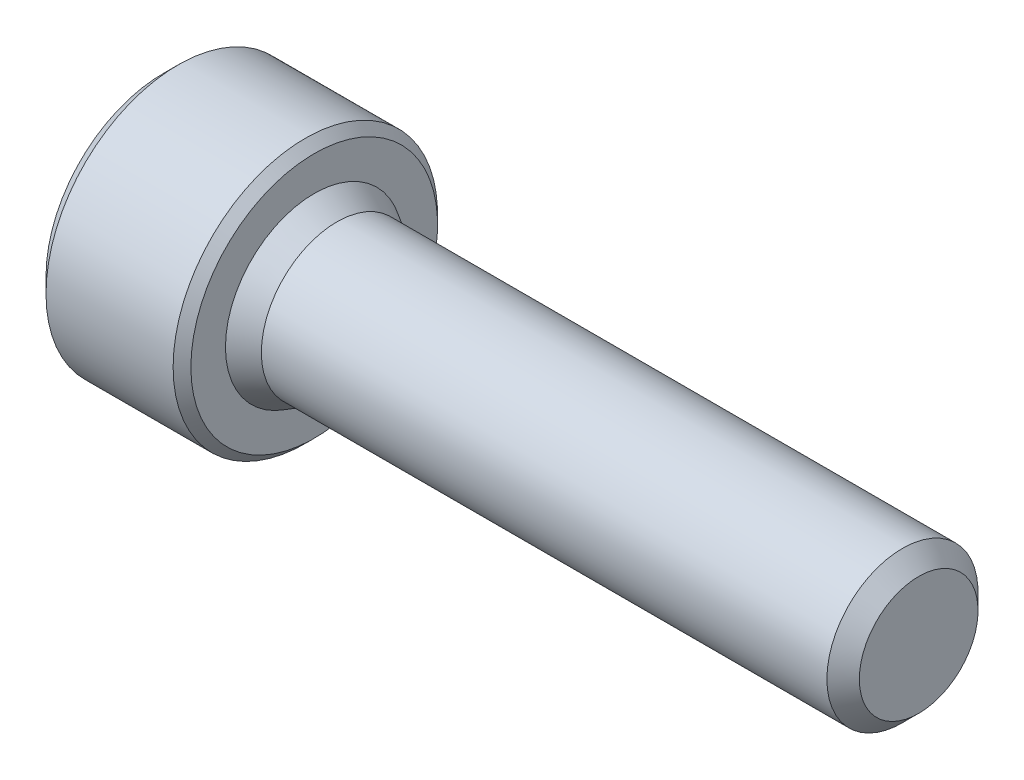
ISO-10303-21;
HEADER;
FILE_DESCRIPTION(('STEP AP214'),'2;1');
FILE_NAME('part.step','',(''),(''),'','','');
FILE_SCHEMA(('AUTOMOTIVE_DESIGN { 1 0 10303 214 1 1 1 1 }'));
ENDSEC;
DATA;
#1=APPLICATION_CONTEXT('core data for automotive mechanical design processes');
#2=APPLICATION_PROTOCOL_DEFINITION('international standard','automotive_design',2000,#1);
#3=PRODUCT_CONTEXT('',#1,'mechanical');
#4=PRODUCT('Part','Part','',(#3));
#5=PRODUCT_RELATED_PRODUCT_CATEGORY('part','',(#4));
#6=PRODUCT_DEFINITION_FORMATION('','',#4);
#7=PRODUCT_DEFINITION_CONTEXT('part definition',#1,'design');
#8=PRODUCT_DEFINITION('design','',#6,#7);
#9=PRODUCT_DEFINITION_SHAPE('','',#8);
#10=(LENGTH_UNIT() NAMED_UNIT(*) SI_UNIT(.MILLI.,.METRE.));
#11=(NAMED_UNIT(*) PLANE_ANGLE_UNIT() SI_UNIT($,.RADIAN.));
#12=(NAMED_UNIT(*) SI_UNIT($,.STERADIAN.) SOLID_ANGLE_UNIT());
#13=UNCERTAINTY_MEASURE_WITH_UNIT(LENGTH_MEASURE(1.E-05),#10,'distance_accuracy_value','');
#14=(GEOMETRIC_REPRESENTATION_CONTEXT(3) GLOBAL_UNCERTAINTY_ASSIGNED_CONTEXT((#13)) GLOBAL_UNIT_ASSIGNED_CONTEXT((#10,
#11,#12)) REPRESENTATION_CONTEXT('',''));
#15=CARTESIAN_POINT('',(0.,0.,0.));
#16=DIRECTION('',(0.,0.,1.));
#17=DIRECTION('',(1.,0.,0.));
#18=AXIS2_PLACEMENT_3D('',#15,#16,#17);
#19=CARTESIAN_POINT('',(-3.79,0.,0.));
#20=DIRECTION('',(-1.,0.,0.));
#21=DIRECTION('',(0.,0.,1.));
#22=AXIS2_PLACEMENT_3D('',#19,#20,#21);
#23=CONICAL_SURFACE('',#22,1.5,0.785398163397448);
#24=CARTESIAN_POINT('',(-5.30116487435809,-2.61096034067314,1.5));
#25=CARTESIAN_POINT('',(-5.23420650938504,-2.53370829627866,1.5));
#26=CARTESIAN_POINT('',(-5.16763700242284,-2.45611209299371,1.5));
#27=CARTESIAN_POINT('',(-5.03555297896726,-2.29996461257693,1.5));
#28=CARTESIAN_POINT('',(-4.97003898048797,-2.22141289781609,1.5));
#29=CARTESIAN_POINT('',(-4.83891117039791,-2.06133394036033,1.5));
#30=CARTESIAN_POINT('',(-4.77332997863924,-1.9797798715034,1.5));
#31=CARTESIAN_POINT('',(-4.6441641304672,-1.81513109677043,1.5));
#32=CARTESIAN_POINT('',(-4.5805789774365,-1.73203678242511,1.5));
#33=CARTESIAN_POINT('',(-4.45607726307992,-1.56368542522901,1.5));
#34=CARTESIAN_POINT('',(-4.39516442141509,-1.47842561333001,1.5));
#35=CARTESIAN_POINT('',(-4.27726615106659,-1.30509518034032,1.5));
#36=CARTESIAN_POINT('',(-4.22028394583719,-1.21702233691642,1.5));
#37=CARTESIAN_POINT('',(-4.11269900721223,-1.03794575713412,1.5));
#38=CARTESIAN_POINT('',(-4.06205019007958,-0.946970076149004,1.5));
#39=CARTESIAN_POINT('',(-3.96984161697298,-0.760530179194546,1.5));
#40=CARTESIAN_POINT('',(-3.92826511196956,-0.665074636727542,1.5));
#41=CARTESIAN_POINT('',(-3.87592198139797,-0.517043812341912,1.5));
#42=CARTESIAN_POINT('',(-3.86002447273079,-0.466291293444624,1.5));
#43=CARTESIAN_POINT('',(-3.83264475677543,-0.363594079986879,1.5));
#44=CARTESIAN_POINT('',(-3.82116184458344,-0.311649577162136,1.5));
#45=CARTESIAN_POINT('',(-3.8033738913667,-0.207193361790282,1.5));
#46=CARTESIAN_POINT('',(-3.79703747528481,-0.154687093985626,1.5));
#47=CARTESIAN_POINT('',(-3.78988941446867,-0.0492965348256741,1.5));
#48=CARTESIAN_POINT('',(-3.78907719770041,0.00358771682144186,1.5));
#49=CARTESIAN_POINT('',(-3.79304249637447,0.109207072247776,1.5));
#50=CARTESIAN_POINT('',(-3.79782693949682,0.161941910011229,1.5));
#51=CARTESIAN_POINT('',(-3.81263573530091,0.266665165094316,1.5));
#52=CARTESIAN_POINT('',(-3.8226611162389,0.318653433882049,1.5));
#53=CARTESIAN_POINT('',(-3.84738480385476,0.421876079504397,1.5));
#54=CARTESIAN_POINT('',(-3.86211567271973,0.473102519240826,1.5));
#55=CARTESIAN_POINT('',(-3.89545612312613,0.574257265531108,1.5));
#56=CARTESIAN_POINT('',(-3.9140657434622,0.624185559095497,1.5));
#57=CARTESIAN_POINT('',(-3.95901788314668,0.733940157954205,1.5));
#58=CARTESIAN_POINT('',(-3.98615666866412,0.793437597021182,1.5));
#59=CARTESIAN_POINT('',(-4.04405325421095,0.910659968679424,1.5));
#60=CARTESIAN_POINT('',(-4.07481314764808,0.968383851400809,1.5));
#61=CARTESIAN_POINT('',(-4.13913997825325,1.08237584472915,1.5));
#62=CARTESIAN_POINT('',(-4.17271206893487,1.13864102379277,1.5));
#63=CARTESIAN_POINT('',(-4.24198426407768,1.24985138029895,1.5));
#64=CARTESIAN_POINT('',(-4.2776847924038,1.30479629174131,1.5));
#65=CARTESIAN_POINT('',(-4.38760959866499,1.46852916738385,1.5));
#66=CARTESIAN_POINT('',(-4.46432099476494,1.57564291426335,1.5));
#67=CARTESIAN_POINT('',(-4.62177231856458,1.78662968756731,1.5));
#68=CARTESIAN_POINT('',(-4.70250774315545,1.89050613406825,1.5));
#69=CARTESIAN_POINT('',(-4.86885566058449,2.09869317108389,1.5));
#70=CARTESIAN_POINT('',(-4.95454021570944,2.20294599293046,1.5));
#71=CARTESIAN_POINT('',(-5.08410689187294,2.35749901632546,1.5));
#72=CARTESIAN_POINT('',(-5.12723125211569,2.40843952414106,1.5));
#73=CARTESIAN_POINT('',(-5.21389983559537,2.50995771584672,1.5));
#74=CARTESIAN_POINT('',(-5.25744403701283,2.56053541835634,1.5));
#75=CARTESIAN_POINT('',(-5.30116487435795,2.61096034067325,1.5));
#76=B_SPLINE_CURVE_WITH_KNOTS('',3,(#24,#25,#26,#27,#28,#29,#30,#31,#32,#33,#34,#35,#36,#37,#38,
#39,#40,#41,#42,#43,#44,#45,#46,#47,#48,#49,#50,#51,#52,#53,#54,#55,#56,#57,#58,#59,#60,#61,#62,
#63,#64,#65,#66,#67,#68,#69,#70,#71,#72,#73,#74,#75),.UNSPECIFIED.,.F.,.F.,(4,2,2,2,2,2,2,2,2,2,
2,2,2,2,2,2,2,2,2,2,2,2,2,2,2,4),(0.,0.306701555412197,0.613549307963092,0.927481742306624,
1.24133544057931,1.55561297154799,1.87014524566996,2.18223615592366,2.4937459248761,
2.65313884314296,2.81250629965171,2.97089473912855,3.12926677714163,3.28783505949279,
3.44643446414715,3.60615606684402,3.76587926712696,3.96189662292142,4.15802786049982,
4.35452673097643,4.55106486452646,4.94612850955205,5.3407595704456,5.74555810360317,
5.94578612118628,6.14600378826241),.UNSPECIFIED.);
#77=CARTESIAN_POINT('',(-4.,-0.82103593100424,1.5));
#78=VERTEX_POINT('',#77);
#79=CARTESIAN_POINT('',(-3.99999999999962,0.821035931007083,1.5));
#80=VERTEX_POINT('',#79);
#81=EDGE_CURVE('E229',#78,#80,#76,.T.);
#82=ORIENTED_EDGE('',*,*,#81,.F.);
#83=CARTESIAN_POINT('',(-4.,0.,0.));
#84=DIRECTION('',(-1.,0.,0.));
#85=DIRECTION('',(0.,0.,1.));
#86=AXIS2_PLACEMENT_3D('',#83,#84,#85);
#87=CIRCLE('',#86,1.71);
#88=EDGE_CURVE('E246',#78,#80,#87,.T.);
#89=ORIENTED_EDGE('',*,*,#88,.T.);
#90=EDGE_LOOP('',(#82,#89));
#91=FACE_BOUND('',#90,.T.);
#92=ADVANCED_FACE('F43',(#91),#23,.F.);
#93=CARTESIAN_POINT('',(-4.00020000000004,0.888311907340062,1.4613986435186));
#94=CARTESIAN_POINT('',(-3.97285549528858,0.916795253127802,1.41206404144468));
#95=CARTESIAN_POINT('',(-3.94721899858802,0.945741554699897,1.3619275764306));
#96=CARTESIAN_POINT('',(-3.90046519939772,1.00469273349456,1.25982113959217));
#97=CARTESIAN_POINT('',(-3.87937116631606,1.03470218517446,1.2078432445753));
#98=CARTESIAN_POINT('',(-3.84335945605182,1.09519758382335,1.1030621404913));
#99=CARTESIAN_POINT('',(-3.82835893457555,1.12567085754942,1.05028088212479));
#100=CARTESIAN_POINT('',(-3.80537820434439,1.18722532970185,0.943665408923706));
#101=CARTESIAN_POINT('',(-3.79738291742976,1.21830507450705,0.889833711834825));
#102=CARTESIAN_POINT('',(-3.79017551999874,1.27295015653521,0.795185653378278));
#103=CARTESIAN_POINT('',(-3.78927338868594,1.29646171635976,0.754462437196964));
#104=CARTESIAN_POINT('',(-3.79189208076777,1.3434300844999,0.673110837229644));
#105=CARTESIAN_POINT('',(-3.79541405057891,1.36688687704541,0.632482480758229));
#106=CARTESIAN_POINT('',(-3.80667673919767,1.4135576061572,0.551646406710319));
#107=CARTESIAN_POINT('',(-3.81442040009998,1.43677136183908,0.511439002434816));
#108=CARTESIAN_POINT('',(-3.83371366876661,1.48280394195856,0.431708234864389));
#109=CARTESIAN_POINT('',(-3.8452647983953,1.50562260463061,0.392185151755623));
#110=CARTESIAN_POINT('',(-3.87672751342048,1.5594641811631,0.298928805641738));
#111=CARTESIAN_POINT('',(-3.89814573077078,1.59026383350887,0.245582242923425));
#112=CARTESIAN_POINT('',(-3.94585513421444,1.65079405729375,0.140740819934493));
#113=CARTESIAN_POINT('',(-3.97212970841799,1.68052787259826,0.0892403411242082));
#114=CARTESIAN_POINT('',(-4.0002,1.70976430401321,0.0386013564815139));
#115=B_SPLINE_CURVE_WITH_KNOTS('',3,(#93,#94,#95,#96,#97,#98,#99,#100,#101,#102,#103,#104,#105,
#106,#107,#108,#109,#110,#111,#112,#113,#114),.UNSPECIFIED.,.F.,.F.,(4,2,2,2,2,2,2,2,2,2,4),(0.,
0.18968538846909,0.380320495712016,0.568269308486614,0.755812576854192,0.896707324123195,
1.03763858895441,1.17866819450446,1.3197542387908,1.51515241346564,1.70989417055558),.UNSPECIFIED.);
#116=CARTESIAN_POINT('',(-4.,0.888520140174541,1.46103797366948));
#117=VERTEX_POINT('',#116);
#118=CARTESIAN_POINT('',(-4.,1.70955607117878,0.0389620263305606));
#119=VERTEX_POINT('',#118);
#120=EDGE_CURVE('E362',#117,#119,#115,.T.);
#121=ORIENTED_EDGE('',*,*,#120,.F.);
#122=EDGE_CURVE('E251',#117,#119,#87,.T.);
#123=ORIENTED_EDGE('',*,*,#122,.T.);
#124=EDGE_LOOP('',(#121,#123));
#125=FACE_BOUND('',#124,.T.);
#126=ADVANCED_FACE('F297',(#125),#23,.F.);
#127=CARTESIAN_POINT('',(-4.0002,1.70976430401321,-0.0386013564815137));
#128=CARTESIAN_POINT('',(-3.97285549528854,1.68128095822548,-0.0879359585554274));
#129=CARTESIAN_POINT('',(-3.94721899858798,1.65233465665338,-0.1380724235695));
#130=CARTESIAN_POINT('',(-3.90046519939769,1.59338347785872,-0.240178860407929));
#131=CARTESIAN_POINT('',(-3.87937116631604,1.56337402617882,-0.292156755424795));
#132=CARTESIAN_POINT('',(-3.84335945605181,1.50287862752994,-0.396937859508784));
#133=CARTESIAN_POINT('',(-3.82835893457554,1.47240535380387,-0.449719117875292));
#134=CARTESIAN_POINT('',(-3.80537820434438,1.41085088165145,-0.556334591076361));
#135=CARTESIAN_POINT('',(-3.79738291742976,1.37977113684626,-0.610166288165238));
#136=CARTESIAN_POINT('',(-3.79017551999874,1.3251260548181,-0.704814346621779));
#137=CARTESIAN_POINT('',(-3.78927338868594,1.30161449499355,-0.745537562803092));
#138=CARTESIAN_POINT('',(-3.79189208076778,1.25464612685341,-0.826889162770413));
#139=CARTESIAN_POINT('',(-3.79541405057891,1.2311893343079,-0.867517519241828));
#140=CARTESIAN_POINT('',(-3.80667673919767,1.18451860519611,-0.948353593289736));
#141=CARTESIAN_POINT('',(-3.81442040009998,1.16130484951423,-0.988560997565239));
#142=CARTESIAN_POINT('',(-3.83371366876662,1.11527226939475,-1.06829176513567));
#143=CARTESIAN_POINT('',(-3.8452647983953,1.0924536067227,-1.10781484824443));
#144=CARTESIAN_POINT('',(-3.87672751342049,1.0386120301902,-1.20107119435833));
#145=CARTESIAN_POINT('',(-3.8981457307708,1.00781237784443,-1.25441775707665));
#146=CARTESIAN_POINT('',(-3.94585513421447,0.947282154059535,-1.3592591800656));
#147=CARTESIAN_POINT('',(-3.97212970841802,0.917548338755017,-1.4107596588759));
#148=CARTESIAN_POINT('',(-4.00020000000004,0.888311907340062,-1.4613986435186));
#149=B_SPLINE_CURVE_WITH_KNOTS('',3,(#127,#128,#129,#130,#131,#132,#133,#134,#135,#136,#137,
#138,#139,#140,#141,#142,#143,#144,#145,#146,#147,#148),.UNSPECIFIED.,.F.,.F.,(4,2,2,2,2,2,2,2,
2,2,4),(0.,0.189685388469072,0.380320495711979,0.568269308486559,0.755812576854118,
0.896707324123121,1.03763858895433,1.17866819450439,1.31975423879072,1.5151524134656,
1.70989417055558),.UNSPECIFIED.);
#150=CARTESIAN_POINT('',(-4.,1.70955607117878,-0.0389620263305606));
#151=VERTEX_POINT('',#150);
#152=CARTESIAN_POINT('',(-4.,0.888520140174541,-1.46103797366948));
#153=VERTEX_POINT('',#152);
#154=EDGE_CURVE('E355',#151,#153,#149,.T.);
#155=ORIENTED_EDGE('',*,*,#154,.F.);
#156=EDGE_CURVE('E340',#151,#153,#87,.T.);
#157=ORIENTED_EDGE('',*,*,#156,.T.);
#158=EDGE_LOOP('',(#155,#157));
#159=FACE_BOUND('',#158,.T.);
#160=ADVANCED_FACE('F302',(#159),#23,.F.);
#161=CARTESIAN_POINT('',(-5.30116487435809,2.61096034067314,-1.5));
#162=CARTESIAN_POINT('',(-5.23420650938504,2.53370829627866,-1.5));
#163=CARTESIAN_POINT('',(-5.16763700242284,2.45611209299371,-1.5));
#164=CARTESIAN_POINT('',(-5.03555297896726,2.29996461257693,-1.5));
#165=CARTESIAN_POINT('',(-4.97003898048797,2.22141289781609,-1.5));
#166=CARTESIAN_POINT('',(-4.83891117039791,2.06133394036033,-1.5));
#167=CARTESIAN_POINT('',(-4.77332997863924,1.9797798715034,-1.5));
#168=CARTESIAN_POINT('',(-4.6441641304672,1.81513109677043,-1.5));
#169=CARTESIAN_POINT('',(-4.5805789774365,1.73203678242511,-1.5));
#170=CARTESIAN_POINT('',(-4.45607726307992,1.56368542522901,-1.5));
#171=CARTESIAN_POINT('',(-4.39516442141509,1.47842561333001,-1.5));
#172=CARTESIAN_POINT('',(-4.27726615106659,1.30509518034032,-1.5));
#173=CARTESIAN_POINT('',(-4.22028394583719,1.21702233691642,-1.5));
#174=CARTESIAN_POINT('',(-4.11269900721223,1.03794575713412,-1.5));
#175=CARTESIAN_POINT('',(-4.06205019007958,0.946970076149004,-1.5));
#176=CARTESIAN_POINT('',(-3.96984161697298,0.760530179194546,-1.5));
#177=CARTESIAN_POINT('',(-3.92826511196956,0.665074636727542,-1.5));
#178=CARTESIAN_POINT('',(-3.87592198139797,0.517043812341912,-1.5));
#179=CARTESIAN_POINT('',(-3.86002447273079,0.466291293444624,-1.5));
#180=CARTESIAN_POINT('',(-3.83264475677543,0.363594079986879,-1.5));
#181=CARTESIAN_POINT('',(-3.82116184458344,0.311649577162136,-1.5));
#182=CARTESIAN_POINT('',(-3.8033738913667,0.207193361790282,-1.5));
#183=CARTESIAN_POINT('',(-3.79703747528481,0.154687093985626,-1.5));
#184=CARTESIAN_POINT('',(-3.78988941446867,0.0492965348256741,-1.5));
#185=CARTESIAN_POINT('',(-3.78907719770041,-0.00358771682144186,-1.5));
#186=CARTESIAN_POINT('',(-3.79304249637447,-0.109207072247776,-1.5));
#187=CARTESIAN_POINT('',(-3.79782693949682,-0.161941910011229,-1.5));
#188=CARTESIAN_POINT('',(-3.81263573530091,-0.266665165094316,-1.5));
#189=CARTESIAN_POINT('',(-3.8226611162389,-0.318653433882049,-1.5));
#190=CARTESIAN_POINT('',(-3.84738480385476,-0.421876079504397,-1.5));
#191=CARTESIAN_POINT('',(-3.86211567271973,-0.473102519240826,-1.5));
#192=CARTESIAN_POINT('',(-3.89545612312613,-0.574257265531108,-1.5));
#193=CARTESIAN_POINT('',(-3.9140657434622,-0.624185559095497,-1.5));
#194=CARTESIAN_POINT('',(-3.95901788314668,-0.733940157954205,-1.5));
#195=CARTESIAN_POINT('',(-3.98615666866412,-0.793437597021182,-1.5));
#196=CARTESIAN_POINT('',(-4.04405325421095,-0.910659968679424,-1.5));
#197=CARTESIAN_POINT('',(-4.07481314764808,-0.968383851400809,-1.5));
#198=CARTESIAN_POINT('',(-4.13913997825325,-1.08237584472915,-1.5));
#199=CARTESIAN_POINT('',(-4.17271206893487,-1.13864102379277,-1.5));
#200=CARTESIAN_POINT('',(-4.24198426407768,-1.24985138029895,-1.5));
#201=CARTESIAN_POINT('',(-4.2776847924038,-1.30479629174131,-1.5));
#202=CARTESIAN_POINT('',(-4.38760959866499,-1.46852916738385,-1.5));
#203=CARTESIAN_POINT('',(-4.46432099476494,-1.57564291426335,-1.5));
#204=CARTESIAN_POINT('',(-4.62177231856458,-1.78662968756731,-1.5));
#205=CARTESIAN_POINT('',(-4.70250774315545,-1.89050613406825,-1.5));
#206=CARTESIAN_POINT('',(-4.86885566058449,-2.09869317108389,-1.5));
#207=CARTESIAN_POINT('',(-4.95454021570944,-2.20294599293046,-1.5));
#208=CARTESIAN_POINT('',(-5.08410689187294,-2.35749901632546,-1.5));
#209=CARTESIAN_POINT('',(-5.12723125211569,-2.40843952414106,-1.5));
#210=CARTESIAN_POINT('',(-5.21389983559537,-2.50995771584672,-1.5));
#211=CARTESIAN_POINT('',(-5.25744403701283,-2.56053541835634,-1.5));
#212=CARTESIAN_POINT('',(-5.30116487435795,-2.61096034067325,-1.5));
#213=B_SPLINE_CURVE_WITH_KNOTS('',3,(#161,#162,#163,#164,#165,#166,#167,#168,#169,#170,#171,
#172,#173,#174,#175,#176,#177,#178,#179,#180,#181,#182,#183,#184,#185,#186,#187,#188,#189,#190,
#191,#192,#193,#194,#195,#196,#197,#198,#199,#200,#201,#202,#203,#204,#205,#206,#207,#208,#209,
#210,#211,#212),.UNSPECIFIED.,.F.,.F.,(4,2,2,2,2,2,2,2,2,2,2,2,2,2,2,2,2,2,2,2,2,2,2,2,2,4),(0.,
0.306701555412197,0.613549307963092,0.927481742306624,1.24133544057931,1.55561297154799,
1.87014524566996,2.18223615592366,2.4937459248761,2.65313884314296,2.81250629965171,
2.97089473912855,3.12926677714163,3.28783505949279,3.44643446414715,3.60615606684402,
3.76587926712696,3.96189662292142,4.15802786049982,4.35452673097643,4.55106486452646,
4.94612850955205,5.3407595704456,5.74555810360317,5.94578612118628,6.14600378826241),.UNSPECIFIED.);
#214=CARTESIAN_POINT('',(-4.,0.82103593100424,-1.5));
#215=VERTEX_POINT('',#214);
#216=CARTESIAN_POINT('',(-3.99999999999962,-0.821035931007083,-1.5));
#217=VERTEX_POINT('',#216);
#218=EDGE_CURVE('E347',#215,#217,#213,.T.);
#219=ORIENTED_EDGE('',*,*,#218,.F.);
#220=EDGE_CURVE('E338',#215,#217,#87,.T.);
#221=ORIENTED_EDGE('',*,*,#220,.T.);
#222=EDGE_LOOP('',(#219,#221));
#223=FACE_BOUND('',#222,.T.);
#224=ADVANCED_FACE('F316',(#223),#23,.F.);
#225=CARTESIAN_POINT('',(-4.00020000000004,-0.888311907340062,-1.4613986435186));
#226=CARTESIAN_POINT('',(-3.97285549528858,-0.916795253127802,-1.41206404144468));
#227=CARTESIAN_POINT('',(-3.94721899858802,-0.945741554699897,-1.3619275764306));
#228=CARTESIAN_POINT('',(-3.90046519939772,-1.00469273349456,-1.25982113959217));
#229=CARTESIAN_POINT('',(-3.87937116631606,-1.03470218517446,-1.2078432445753));
#230=CARTESIAN_POINT('',(-3.84335945605182,-1.09519758382335,-1.1030621404913));
#231=CARTESIAN_POINT('',(-3.82835893457555,-1.12567085754942,-1.05028088212479));
#232=CARTESIAN_POINT('',(-3.80537820434439,-1.18722532970185,-0.943665408923706));
#233=CARTESIAN_POINT('',(-3.79738291742976,-1.21830507450705,-0.889833711834825));
#234=CARTESIAN_POINT('',(-3.79017551999874,-1.27295015653521,-0.795185653378278));
#235=CARTESIAN_POINT('',(-3.78927338868594,-1.29646171635976,-0.754462437196964));
#236=CARTESIAN_POINT('',(-3.79189208076777,-1.3434300844999,-0.673110837229644));
#237=CARTESIAN_POINT('',(-3.79541405057891,-1.36688687704541,-0.632482480758229));
#238=CARTESIAN_POINT('',(-3.80667673919767,-1.4135576061572,-0.551646406710319));
#239=CARTESIAN_POINT('',(-3.81442040009998,-1.43677136183908,-0.511439002434816));
#240=CARTESIAN_POINT('',(-3.83371366876661,-1.48280394195856,-0.431708234864389));
#241=CARTESIAN_POINT('',(-3.8452647983953,-1.50562260463061,-0.392185151755623));
#242=CARTESIAN_POINT('',(-3.87672751342048,-1.5594641811631,-0.298928805641738));
#243=CARTESIAN_POINT('',(-3.89814573077078,-1.59026383350887,-0.245582242923425));
#244=CARTESIAN_POINT('',(-3.94585513421444,-1.65079405729375,-0.140740819934493));
#245=CARTESIAN_POINT('',(-3.97212970841799,-1.68052787259826,-0.0892403411242082));
#246=CARTESIAN_POINT('',(-4.0002,-1.70976430401321,-0.0386013564815139));
#247=B_SPLINE_CURVE_WITH_KNOTS('',3,(#225,#226,#227,#228,#229,#230,#231,#232,#233,#234,#235,
#236,#237,#238,#239,#240,#241,#242,#243,#244,#245,#246),.UNSPECIFIED.,.F.,.F.,(4,2,2,2,2,2,2,2,
2,2,4),(0.,0.18968538846909,0.380320495712016,0.568269308486614,0.755812576854192,
0.896707324123195,1.03763858895441,1.17866819450446,1.3197542387908,1.51515241346564,
1.70989417055558),.UNSPECIFIED.);
#248=CARTESIAN_POINT('',(-4.,-0.888520140174541,-1.46103797366948));
#249=VERTEX_POINT('',#248);
#250=CARTESIAN_POINT('',(-4.,-1.70955607117878,-0.0389620263305606));
#251=VERTEX_POINT('',#250);
#252=EDGE_CURVE('E327',#249,#251,#247,.T.);
#253=ORIENTED_EDGE('',*,*,#252,.F.);
#254=EDGE_CURVE('E329',#249,#251,#87,.T.);
#255=ORIENTED_EDGE('',*,*,#254,.T.);
#256=EDGE_LOOP('',(#253,#255));
#257=FACE_BOUND('',#256,.T.);
#258=ADVANCED_FACE('F307',(#257),#23,.F.);
#259=CARTESIAN_POINT('',(0.,3.5,0.));
#260=DIRECTION('',(-1.,0.,0.));
#261=DIRECTION('',(0.,0.,1.));
#262=AXIS2_PLACEMENT_3D('',#259,#260,#261);
#263=PLANE('',#262);
#264=CARTESIAN_POINT('',(0.,0.,0.));
#265=DIRECTION('',(-1.,0.,0.));
#266=DIRECTION('',(0.,0.,1.));
#267=AXIS2_PLACEMENT_3D('',#264,#265,#266);
#268=CIRCLE('',#267,2.35);
#269=CARTESIAN_POINT('',(0.,0.,2.35));
#270=VERTEX_POINT('',#269);
#271=EDGE_CURVE('E11',#270,#270,#268,.T.);
#272=ORIENTED_EDGE('',*,*,#271,.T.);
#273=EDGE_LOOP('',(#272));
#274=FACE_BOUND('',#273,.T.);
#275=CARTESIAN_POINT('',(0.,0.,0.));
#276=DIRECTION('',(-1.,0.,0.));
#277=DIRECTION('',(0.,0.,1.));
#278=AXIS2_PLACEMENT_3D('',#275,#276,#277);
#279=CIRCLE('',#278,3.265);
#280=CARTESIAN_POINT('',(0.,0.,3.265));
#281=VERTEX_POINT('',#280);
#282=EDGE_CURVE('E252',#281,#281,#279,.T.);
#283=ORIENTED_EDGE('',*,*,#282,.F.);
#284=EDGE_LOOP('',(#283));
#285=FACE_BOUND('',#284,.T.);
#286=ADVANCED_FACE('F315',(#274,#285),#263,.F.);
#287=CARTESIAN_POINT('',(0.6,0.,0.));
#288=DIRECTION('',(-1.,0.,0.));
#289=DIRECTION('',(0.,0.,1.));
#290=AXIS2_PLACEMENT_3D('',#287,#288,#289);
#291=CONICAL_SURFACE('',#290,2.,0.52807444842636);
#292=ORIENTED_EDGE('',*,*,#271,.F.);
#293=EDGE_LOOP('',(#292));
#294=FACE_BOUND('',#293,.T.);
#295=CARTESIAN_POINT('',(0.6,0.,0.));
#296=DIRECTION('',(-1.,0.,0.));
#297=DIRECTION('',(0.,0.,1.));
#298=AXIS2_PLACEMENT_3D('',#295,#296,#297);
#299=CIRCLE('',#298,2.);
#300=CARTESIAN_POINT('',(0.6,0.,2.));
#301=VERTEX_POINT('',#300);
#302=EDGE_CURVE('E51',#301,#301,#299,.T.);
#303=ORIENTED_EDGE('',*,*,#302,.T.);
#304=EDGE_LOOP('',(#303));
#305=FACE_BOUND('',#304,.T.);
#306=ADVANCED_FACE('F272',(#294,#305),#291,.T.);
#307=CARTESIAN_POINT('',(16.,0.,0.));
#308=DIRECTION('',(-1.,0.,0.));
#309=DIRECTION('',(0.,0.,1.));
#310=AXIS2_PLACEMENT_3D('',#307,#308,#309);
#311=CYLINDRICAL_SURFACE('',#310,2.);
#312=ORIENTED_EDGE('',*,*,#302,.F.);
#313=EDGE_LOOP('',(#312));
#314=FACE_BOUND('',#313,.T.);
#315=CARTESIAN_POINT('',(15.5705,0.,0.));
#316=DIRECTION('',(-1.,0.,0.));
#317=DIRECTION('',(0.,0.,1.));
#318=AXIS2_PLACEMENT_3D('',#315,#316,#317);
#319=CIRCLE('',#318,2.);
#320=CARTESIAN_POINT('',(15.5705,0.,2.));
#321=VERTEX_POINT('',#320);
#322=EDGE_CURVE('E267',#321,#321,#319,.T.);
#323=ORIENTED_EDGE('',*,*,#322,.T.);
#324=EDGE_LOOP('',(#323));
#325=FACE_BOUND('',#324,.T.);
#326=ADVANCED_FACE('F274',(#314,#325),#311,.T.);
#327=CARTESIAN_POINT('',(16.,0.,0.));
#328=DIRECTION('',(-1.,0.,0.));
#329=DIRECTION('',(0.,0.,1.));
#330=AXIS2_PLACEMENT_3D('',#327,#328,#329);
#331=CONICAL_SURFACE('',#330,1.5705,0.785398163397447);
#332=ORIENTED_EDGE('',*,*,#322,.F.);
#333=EDGE_LOOP('',(#332));
#334=FACE_BOUND('',#333,.T.);
#335=CARTESIAN_POINT('',(16.,0.,0.));
#336=DIRECTION('',(-1.,0.,0.));
#337=DIRECTION('',(0.,0.,1.));
#338=AXIS2_PLACEMENT_3D('',#335,#336,#337);
#339=CIRCLE('',#338,1.5705);
#340=CARTESIAN_POINT('',(16.,0.,1.5705));
#341=VERTEX_POINT('',#340);
#342=EDGE_CURVE('E264',#341,#341,#339,.T.);
#343=ORIENTED_EDGE('',*,*,#342,.T.);
#344=EDGE_LOOP('',(#343));
#345=FACE_BOUND('',#344,.T.);
#346=ADVANCED_FACE('F277',(#334,#345),#331,.T.);
#347=CARTESIAN_POINT('',(16.,1.5705,0.));
#348=DIRECTION('',(-1.,0.,0.));
#349=DIRECTION('',(0.,0.,1.));
#350=AXIS2_PLACEMENT_3D('',#347,#348,#349);
#351=PLANE('',#350);
#352=ORIENTED_EDGE('',*,*,#342,.F.);
#353=EDGE_LOOP('',(#352));
#354=FACE_BOUND('',#353,.T.);
#355=ADVANCED_FACE('F283',(#354),#351,.F.);
#356=CARTESIAN_POINT('',(-0.235,0.,0.));
#357=DIRECTION('',(-1.,0.,0.));
#358=DIRECTION('',(0.,0.,1.));
#359=AXIS2_PLACEMENT_3D('',#356,#357,#358);
#360=CONICAL_SURFACE('',#359,3.5,0.785398163397448);
#361=ORIENTED_EDGE('',*,*,#282,.T.);
#362=EDGE_LOOP('',(#361));
#363=FACE_BOUND('',#362,.T.);
#364=CARTESIAN_POINT('',(-0.235,0.,0.));
#365=DIRECTION('',(-1.,0.,0.));
#366=DIRECTION('',(0.,0.,1.));
#367=AXIS2_PLACEMENT_3D('',#364,#365,#366);
#368=CIRCLE('',#367,3.5);
#369=CARTESIAN_POINT('',(-0.235,0.,3.5));
#370=VERTEX_POINT('',#369);
#371=EDGE_CURVE('E255',#370,#370,#368,.T.);
#372=ORIENTED_EDGE('',*,*,#371,.F.);
#373=EDGE_LOOP('',(#372));
#374=FACE_BOUND('',#373,.T.);
#375=ADVANCED_FACE('F288',(#363,#374),#360,.T.);
#376=CARTESIAN_POINT('',(16.,0.,0.));
#377=DIRECTION('',(-1.,0.,0.));
#378=DIRECTION('',(0.,0.,1.));
#379=AXIS2_PLACEMENT_3D('',#376,#377,#378);
#380=CYLINDRICAL_SURFACE('',#379,3.5);
#381=ORIENTED_EDGE('',*,*,#371,.T.);
#382=EDGE_LOOP('',(#381));
#383=FACE_BOUND('',#382,.T.);
#384=CARTESIAN_POINT('',(-3.6,0.,0.));
#385=DIRECTION('',(-1.,0.,0.));
#386=DIRECTION('',(0.,0.,1.));
#387=AXIS2_PLACEMENT_3D('',#384,#385,#386);
#388=CIRCLE('',#387,3.5);
#389=CARTESIAN_POINT('',(-3.6,0.,3.5));
#390=VERTEX_POINT('',#389);
#391=EDGE_CURVE('E258',#390,#390,#388,.T.);
#392=ORIENTED_EDGE('',*,*,#391,.F.);
#393=EDGE_LOOP('',(#392));
#394=FACE_BOUND('',#393,.T.);
#395=ADVANCED_FACE('F293',(#383,#394),#380,.T.);
#396=CARTESIAN_POINT('',(-4.,0.,0.));
#397=DIRECTION('',(1.,0.,0.));
#398=DIRECTION('',(0.,0.,-1.));
#399=AXIS2_PLACEMENT_3D('',#396,#397,#398);
#400=CONICAL_SURFACE('',#399,3.1,0.785398163397448);
#401=ORIENTED_EDGE('',*,*,#391,.T.);
#402=EDGE_LOOP('',(#401));
#403=FACE_BOUND('',#402,.T.);
#404=CARTESIAN_POINT('',(-4.,0.,0.));
#405=DIRECTION('',(-1.,0.,0.));
#406=DIRECTION('',(0.,0.,1.));
#407=AXIS2_PLACEMENT_3D('',#404,#405,#406);
#408=CIRCLE('',#407,3.1);
#409=CARTESIAN_POINT('',(-4.,0.,3.1));
#410=VERTEX_POINT('',#409);
#411=EDGE_CURVE('E261',#410,#410,#408,.T.);
#412=ORIENTED_EDGE('',*,*,#411,.F.);
#413=EDGE_LOOP('',(#412));
#414=FACE_BOUND('',#413,.T.);
#415=ADVANCED_FACE('F311',(#403,#414),#400,.T.);
#416=CARTESIAN_POINT('',(-4.,0.,0.));
#417=DIRECTION('',(1.,0.,0.));
#418=DIRECTION('',(0.,0.,-1.));
#419=AXIS2_PLACEMENT_3D('',#416,#417,#418);
#420=PLANE('',#419);
#421=DIRECTION('',(0.,-0.500000000000009,0.866025403784433));
#422=VECTOR('',#421,1.);
#423=CARTESIAN_POINT('',(-4.,1.29903810567666,0.750000000000019));
#424=LINE('',#423,#422);
#425=CARTESIAN_POINT('',(-4.,0.86602540378444,1.5));
#426=VERTEX_POINT('',#425);
#427=EDGE_CURVE('E242',#117,#426,#424,.T.);
#428=ORIENTED_EDGE('',*,*,#427,.T.);
#429=DIRECTION('',(0.,-1.,0.));
#430=VECTOR('',#429,1.);
#431=CARTESIAN_POINT('',(-4.,0.,1.5));
#432=LINE('',#431,#430);
#433=EDGE_CURVE('E237',#426,#80,#432,.T.);
#434=ORIENTED_EDGE('',*,*,#433,.T.);
#435=ORIENTED_EDGE('',*,*,#88,.F.);
#436=CARTESIAN_POINT('',(-4.,-0.86602540378444,1.5));
#437=VERTEX_POINT('',#436);
#438=EDGE_CURVE('E236',#78,#437,#432,.T.);
#439=ORIENTED_EDGE('',*,*,#438,.T.);
#440=DIRECTION('',(0.,-0.500000000000009,-0.866025403784433));
#441=VECTOR('',#440,1.);
#442=CARTESIAN_POINT('',(-4.,-1.29903810567666,0.750000000000019));
#443=LINE('',#442,#441);
#444=CARTESIAN_POINT('',(-4.,-0.888520140174541,1.46103797366948));
#445=VERTEX_POINT('',#444);
#446=EDGE_CURVE('E159',#437,#445,#443,.T.);
#447=ORIENTED_EDGE('',*,*,#446,.T.);
#448=CARTESIAN_POINT('',(-4.,-1.70955607117878,0.0389620263305606));
#449=VERTEX_POINT('',#448);
#450=EDGE_CURVE('E250',#449,#445,#87,.T.);
#451=ORIENTED_EDGE('',*,*,#450,.F.);
#452=CARTESIAN_POINT('',(-4.,-1.7320508075689,0.));
#453=VERTEX_POINT('',#452);
#454=EDGE_CURVE('E210',#449,#453,#443,.T.);
#455=ORIENTED_EDGE('',*,*,#454,.T.);
#456=DIRECTION('',(0.,0.500000000000009,-0.866025403784433));
#457=VECTOR('',#456,1.);
#458=CARTESIAN_POINT('',(-4.,-1.29903810567666,-0.750000000000019));
#459=LINE('',#458,#457);
#460=EDGE_CURVE('E332',#453,#251,#459,.T.);
#461=ORIENTED_EDGE('',*,*,#460,.T.);
#462=ORIENTED_EDGE('',*,*,#254,.F.);
#463=CARTESIAN_POINT('',(-4.,-0.86602540378444,-1.5));
#464=VERTEX_POINT('',#463);
#465=EDGE_CURVE('E331',#249,#464,#459,.T.);
#466=ORIENTED_EDGE('',*,*,#465,.T.);
#467=DIRECTION('',(0.,1.,0.));
#468=VECTOR('',#467,1.);
#469=CARTESIAN_POINT('',(-4.,0.,-1.5));
#470=LINE('',#469,#468);
#471=EDGE_CURVE('E346',#464,#217,#470,.T.);
#472=ORIENTED_EDGE('',*,*,#471,.T.);
#473=ORIENTED_EDGE('',*,*,#220,.F.);
#474=CARTESIAN_POINT('',(-4.,0.86602540378444,-1.5));
#475=VERTEX_POINT('',#474);
#476=EDGE_CURVE('E349',#215,#475,#470,.T.);
#477=ORIENTED_EDGE('',*,*,#476,.T.);
#478=DIRECTION('',(0.,0.500000000000009,0.866025403784433));
#479=VECTOR('',#478,1.);
#480=CARTESIAN_POINT('',(-4.,1.29903810567666,-0.750000000000019));
#481=LINE('',#480,#479);
#482=EDGE_CURVE('E353',#475,#153,#481,.T.);
#483=ORIENTED_EDGE('',*,*,#482,.T.);
#484=ORIENTED_EDGE('',*,*,#156,.F.);
#485=CARTESIAN_POINT('',(-4.,1.7320508075689,0.));
#486=VERTEX_POINT('',#485);
#487=EDGE_CURVE('E357',#151,#486,#481,.T.);
#488=ORIENTED_EDGE('',*,*,#487,.T.);
#489=EDGE_CURVE('E238',#486,#119,#424,.T.);
#490=ORIENTED_EDGE('',*,*,#489,.T.);
#491=ORIENTED_EDGE('',*,*,#122,.F.);
#492=EDGE_LOOP('',(#428,#434,#435,#439,#447,#451,#455,#461,#462,#466,#472,#473,#477,#483,#484,
#488,#490,#491));
#493=FACE_BOUND('',#492,.T.);
#494=ORIENTED_EDGE('',*,*,#411,.T.);
#495=EDGE_LOOP('',(#494));
#496=FACE_BOUND('',#495,.T.);
#497=ADVANCED_FACE('F45',(#493,#496),#420,.F.);
#498=CARTESIAN_POINT('',(-4.0002,-1.70976430401321,0.0386013564815137));
#499=CARTESIAN_POINT('',(-3.97285549528854,-1.68128095822548,0.0879359585554274));
#500=CARTESIAN_POINT('',(-3.94721899858798,-1.65233465665338,0.1380724235695));
#501=CARTESIAN_POINT('',(-3.90046519939769,-1.59338347785872,0.240178860407929));
#502=CARTESIAN_POINT('',(-3.87937116631604,-1.56337402617882,0.292156755424795));
#503=CARTESIAN_POINT('',(-3.84335945605181,-1.50287862752994,0.396937859508784));
#504=CARTESIAN_POINT('',(-3.82835893457554,-1.47240535380387,0.449719117875292));
#505=CARTESIAN_POINT('',(-3.80537820434438,-1.41085088165145,0.556334591076361));
#506=CARTESIAN_POINT('',(-3.79738291742976,-1.37977113684626,0.610166288165238));
#507=CARTESIAN_POINT('',(-3.79017551999874,-1.3251260548181,0.704814346621779));
#508=CARTESIAN_POINT('',(-3.78927338868594,-1.30161449499355,0.745537562803092));
#509=CARTESIAN_POINT('',(-3.79189208076778,-1.25464612685341,0.826889162770413));
#510=CARTESIAN_POINT('',(-3.79541405057891,-1.2311893343079,0.867517519241828));
#511=CARTESIAN_POINT('',(-3.80667673919767,-1.18451860519611,0.948353593289736));
#512=CARTESIAN_POINT('',(-3.81442040009998,-1.16130484951423,0.988560997565239));
#513=CARTESIAN_POINT('',(-3.83371366876662,-1.11527226939475,1.06829176513567));
#514=CARTESIAN_POINT('',(-3.8452647983953,-1.0924536067227,1.10781484824443));
#515=CARTESIAN_POINT('',(-3.87672751342049,-1.0386120301902,1.20107119435833));
#516=CARTESIAN_POINT('',(-3.8981457307708,-1.00781237784443,1.25441775707665));
#517=CARTESIAN_POINT('',(-3.94585513421447,-0.947282154059535,1.3592591800656));
#518=CARTESIAN_POINT('',(-3.97212970841802,-0.917548338755017,1.4107596588759));
#519=CARTESIAN_POINT('',(-4.00020000000004,-0.888311907340062,1.4613986435186));
#520=B_SPLINE_CURVE_WITH_KNOTS('',3,(#498,#499,#500,#501,#502,#503,#504,#505,#506,#507,#508,
#509,#510,#511,#512,#513,#514,#515,#516,#517,#518,#519),.UNSPECIFIED.,.F.,.F.,(4,2,2,2,2,2,2,2,
2,2,4),(0.,0.189685388469072,0.380320495711979,0.568269308486559,0.755812576854118,
0.896707324123121,1.03763858895433,1.17866819450439,1.31975423879072,1.5151524134656,
1.70989417055558),.UNSPECIFIED.);
#521=EDGE_CURVE('E202',#449,#445,#520,.T.);
#522=ORIENTED_EDGE('',*,*,#521,.F.);
#523=ORIENTED_EDGE('',*,*,#450,.T.);
#524=EDGE_LOOP('',(#522,#523));
#525=FACE_BOUND('',#524,.T.);
#526=ADVANCED_FACE('F212',(#525),#23,.F.);
#527=CARTESIAN_POINT('',(-6.,0.86602540378444,1.5));
#528=DIRECTION('',(0.,0.,1.));
#529=DIRECTION('',(1.,0.,0.));
#530=AXIS2_PLACEMENT_3D('',#527,#528,#529);
#531=PLANE('',#530);
#532=ORIENTED_EDGE('',*,*,#81,.T.);
#533=ORIENTED_EDGE('',*,*,#433,.F.);
#534=DIRECTION('',(1.,0.,0.));
#535=VECTOR('',#534,1.);
#536=CARTESIAN_POINT('',(-6.,0.86602540378444,1.5));
#537=LINE('',#536,#535);
#538=CARTESIAN_POINT('',(-2.,0.86602540378444,1.5));
#539=VERTEX_POINT('',#538);
#540=EDGE_CURVE('E193',#426,#539,#537,.T.);
#541=ORIENTED_EDGE('',*,*,#540,.T.);
#542=DIRECTION('',(0.,-1.,0.));
#543=VECTOR('',#542,1.);
#544=CARTESIAN_POINT('',(-2.,0.86602540378444,1.5));
#545=LINE('',#544,#543);
#546=CARTESIAN_POINT('',(-2.,0.,1.5));
#547=VERTEX_POINT('',#546);
#548=EDGE_CURVE('E170',#539,#547,#545,.T.);
#549=ORIENTED_EDGE('',*,*,#548,.T.);
#550=CARTESIAN_POINT('',(-2.,-0.86602540378444,1.5));
#551=VERTEX_POINT('',#550);
#552=EDGE_CURVE('E167',#547,#551,#545,.T.);
#553=ORIENTED_EDGE('',*,*,#552,.T.);
#554=DIRECTION('',(1.,0.,0.));
#555=VECTOR('',#554,1.);
#556=CARTESIAN_POINT('',(-6.,-0.86602540378444,1.5));
#557=LINE('',#556,#555);
#558=EDGE_CURVE('E151',#437,#551,#557,.T.);
#559=ORIENTED_EDGE('',*,*,#558,.F.);
#560=ORIENTED_EDGE('',*,*,#438,.F.);
#561=EDGE_LOOP('',(#532,#533,#541,#549,#553,#559,#560));
#562=FACE_BOUND('',#561,.T.);
#563=ADVANCED_FACE('F168',(#562),#531,.F.);
#564=CARTESIAN_POINT('',(-6.,1.7320508075689,0.));
#565=DIRECTION('',(0.,0.866025403784433,0.500000000000009));
#566=DIRECTION('',(0.,-0.500000000000009,0.866025403784433));
#567=AXIS2_PLACEMENT_3D('',#564,#565,#566);
#568=PLANE('',#567);
#569=ORIENTED_EDGE('',*,*,#120,.T.);
#570=ORIENTED_EDGE('',*,*,#489,.F.);
#571=DIRECTION('',(1.,0.,0.));
#572=VECTOR('',#571,1.);
#573=CARTESIAN_POINT('',(-6.,1.7320508075689,0.));
#574=LINE('',#573,#572);
#575=CARTESIAN_POINT('',(-2.,1.7320508075689,0.));
#576=VERTEX_POINT('',#575);
#577=EDGE_CURVE('E195',#486,#576,#574,.T.);
#578=ORIENTED_EDGE('',*,*,#577,.T.);
#579=DIRECTION('',(0.,-0.500000000000009,0.866025403784433));
#580=VECTOR('',#579,1.);
#581=CARTESIAN_POINT('',(-2.,1.7320508075689,0.));
#582=LINE('',#581,#580);
#583=CARTESIAN_POINT('',(-2.,1.29903810567666,0.750000000000019));
#584=VERTEX_POINT('',#583);
#585=EDGE_CURVE('E163',#576,#584,#582,.T.);
#586=ORIENTED_EDGE('',*,*,#585,.T.);
#587=EDGE_CURVE('E190',#584,#539,#582,.T.);
#588=ORIENTED_EDGE('',*,*,#587,.T.);
#589=ORIENTED_EDGE('',*,*,#540,.F.);
#590=ORIENTED_EDGE('',*,*,#427,.F.);
#591=EDGE_LOOP('',(#569,#570,#578,#586,#588,#589,#590));
#592=FACE_BOUND('',#591,.T.);
#593=ADVANCED_FACE('F226',(#592),#568,.F.);
#594=CARTESIAN_POINT('',(-6.,0.86602540378444,-1.5));
#595=DIRECTION('',(0.,0.866025403784433,-0.500000000000009));
#596=DIRECTION('',(0.,0.500000000000009,0.866025403784433));
#597=AXIS2_PLACEMENT_3D('',#594,#595,#596);
#598=PLANE('',#597);
#599=ORIENTED_EDGE('',*,*,#154,.T.);
#600=ORIENTED_EDGE('',*,*,#482,.F.);
#601=DIRECTION('',(1.,0.,0.));
#602=VECTOR('',#601,1.);
#603=CARTESIAN_POINT('',(-6.,0.86602540378444,-1.5));
#604=LINE('',#603,#602);
#605=CARTESIAN_POINT('',(-2.,0.86602540378444,-1.5));
#606=VERTEX_POINT('',#605);
#607=EDGE_CURVE('E197',#475,#606,#604,.T.);
#608=ORIENTED_EDGE('',*,*,#607,.T.);
#609=DIRECTION('',(0.,0.500000000000009,0.866025403784433));
#610=VECTOR('',#609,1.);
#611=CARTESIAN_POINT('',(-2.,0.86602540378444,-1.5));
#612=LINE('',#611,#610);
#613=CARTESIAN_POINT('',(-2.,1.29903810567666,-0.750000000000019));
#614=VERTEX_POINT('',#613);
#615=EDGE_CURVE('E187',#606,#614,#612,.T.);
#616=ORIENTED_EDGE('',*,*,#615,.T.);
#617=EDGE_CURVE('E186',#614,#576,#612,.T.);
#618=ORIENTED_EDGE('',*,*,#617,.T.);
#619=ORIENTED_EDGE('',*,*,#577,.F.);
#620=ORIENTED_EDGE('',*,*,#487,.F.);
#621=EDGE_LOOP('',(#599,#600,#608,#616,#618,#619,#620));
#622=FACE_BOUND('',#621,.T.);
#623=ADVANCED_FACE('F372',(#622),#598,.F.);
#624=CARTESIAN_POINT('',(-6.,-0.86602540378444,-1.5));
#625=DIRECTION('',(0.,0.,-1.));
#626=DIRECTION('',(-1.,0.,0.));
#627=AXIS2_PLACEMENT_3D('',#624,#625,#626);
#628=PLANE('',#627);
#629=ORIENTED_EDGE('',*,*,#218,.T.);
#630=ORIENTED_EDGE('',*,*,#471,.F.);
#631=DIRECTION('',(1.,0.,0.));
#632=VECTOR('',#631,1.);
#633=CARTESIAN_POINT('',(-6.,-0.86602540378444,-1.5));
#634=LINE('',#633,#632);
#635=CARTESIAN_POINT('',(-2.,-0.86602540378444,-1.5));
#636=VERTEX_POINT('',#635);
#637=EDGE_CURVE('E199',#464,#636,#634,.T.);
#638=ORIENTED_EDGE('',*,*,#637,.T.);
#639=DIRECTION('',(0.,1.,0.));
#640=VECTOR('',#639,1.);
#641=CARTESIAN_POINT('',(-2.,-0.86602540378444,-1.5));
#642=LINE('',#641,#640);
#643=CARTESIAN_POINT('',(-2.,0.,-1.5));
#644=VERTEX_POINT('',#643);
#645=EDGE_CURVE('E183',#636,#644,#642,.T.);
#646=ORIENTED_EDGE('',*,*,#645,.T.);
#647=EDGE_CURVE('E182',#644,#606,#642,.T.);
#648=ORIENTED_EDGE('',*,*,#647,.T.);
#649=ORIENTED_EDGE('',*,*,#607,.F.);
#650=ORIENTED_EDGE('',*,*,#476,.F.);
#651=EDGE_LOOP('',(#629,#630,#638,#646,#648,#649,#650));
#652=FACE_BOUND('',#651,.T.);
#653=ADVANCED_FACE('F406',(#652),#628,.F.);
#654=CARTESIAN_POINT('',(-6.,-1.7320508075689,0.));
#655=DIRECTION('',(0.,-0.866025403784433,-0.500000000000009));
#656=DIRECTION('',(0.,0.500000000000009,-0.866025403784433));
#657=AXIS2_PLACEMENT_3D('',#654,#655,#656);
#658=PLANE('',#657);
#659=ORIENTED_EDGE('',*,*,#252,.T.);
#660=ORIENTED_EDGE('',*,*,#460,.F.);
#661=DIRECTION('',(1.,0.,0.));
#662=VECTOR('',#661,1.);
#663=CARTESIAN_POINT('',(-6.,-1.7320508075689,0.));
#664=LINE('',#663,#662);
#665=CARTESIAN_POINT('',(-2.,-1.7320508075689,0.));
#666=VERTEX_POINT('',#665);
#667=EDGE_CURVE('E162',#453,#666,#664,.T.);
#668=ORIENTED_EDGE('',*,*,#667,.T.);
#669=DIRECTION('',(0.,0.500000000000009,-0.866025403784433));
#670=VECTOR('',#669,1.);
#671=CARTESIAN_POINT('',(-2.,-1.7320508075689,0.));
#672=LINE('',#671,#670);
#673=CARTESIAN_POINT('',(-2.,-1.29903810567665,-0.750000000000014));
#674=VERTEX_POINT('',#673);
#675=EDGE_CURVE('E58',#666,#674,#672,.T.);
#676=ORIENTED_EDGE('',*,*,#675,.T.);
#677=EDGE_CURVE('E177',#674,#636,#672,.T.);
#678=ORIENTED_EDGE('',*,*,#677,.T.);
#679=ORIENTED_EDGE('',*,*,#637,.F.);
#680=ORIENTED_EDGE('',*,*,#465,.F.);
#681=EDGE_LOOP('',(#659,#660,#668,#676,#678,#679,#680));
#682=FACE_BOUND('',#681,.T.);
#683=ADVANCED_FACE('F221',(#682),#658,.F.);
#684=CARTESIAN_POINT('',(-6.,-0.86602540378444,1.5));
#685=DIRECTION('',(0.,-0.866025403784433,0.500000000000009));
#686=DIRECTION('',(0.,-0.500000000000009,-0.866025403784433));
#687=AXIS2_PLACEMENT_3D('',#684,#685,#686);
#688=PLANE('',#687);
#689=ORIENTED_EDGE('',*,*,#521,.T.);
#690=ORIENTED_EDGE('',*,*,#446,.F.);
#691=ORIENTED_EDGE('',*,*,#558,.T.);
#692=DIRECTION('',(0.,-0.500000000000009,-0.866025403784433));
#693=VECTOR('',#692,1.);
#694=CARTESIAN_POINT('',(-2.,-0.86602540378444,1.5));
#695=LINE('',#694,#693);
#696=CARTESIAN_POINT('',(-2.,-1.29903810567666,0.750000000000019));
#697=VERTEX_POINT('',#696);
#698=EDGE_CURVE('E156',#551,#697,#695,.T.);
#699=ORIENTED_EDGE('',*,*,#698,.T.);
#700=EDGE_CURVE('E178',#697,#666,#695,.T.);
#701=ORIENTED_EDGE('',*,*,#700,.T.);
#702=ORIENTED_EDGE('',*,*,#667,.F.);
#703=ORIENTED_EDGE('',*,*,#454,.F.);
#704=EDGE_LOOP('',(#689,#690,#691,#699,#701,#702,#703));
#705=FACE_BOUND('',#704,.T.);
#706=ADVANCED_FACE('F153',(#705),#688,.F.);
#707=CARTESIAN_POINT('',(-2.,0.,0.));
#708=DIRECTION('',(1.,0.,0.));
#709=DIRECTION('',(0.,0.,-1.));
#710=AXIS2_PLACEMENT_3D('',#707,#708,#709);
#711=PLANE('',#710);
#712=CARTESIAN_POINT('',(-2.,0.,0.));
#713=DIRECTION('',(-1.,0.,0.));
#714=DIRECTION('',(0.,0.,1.));
#715=AXIS2_PLACEMENT_3D('',#712,#713,#714);
#716=CIRCLE('',#715,1.5);
#717=EDGE_CURVE('E427',#614,#644,#716,.T.);
#718=ORIENTED_EDGE('',*,*,#717,.F.);
#719=ORIENTED_EDGE('',*,*,#615,.F.);
#720=ORIENTED_EDGE('',*,*,#647,.F.);
#721=EDGE_LOOP('',(#718,#719,#720));
#722=FACE_BOUND('',#721,.T.);
#723=ADVANCED_FACE('F220',(#722),#711,.F.);
#724=EDGE_CURVE('E247',#584,#614,#716,.T.);
#725=ORIENTED_EDGE('',*,*,#724,.F.);
#726=ORIENTED_EDGE('',*,*,#585,.F.);
#727=ORIENTED_EDGE('',*,*,#617,.F.);
#728=EDGE_LOOP('',(#725,#726,#727));
#729=FACE_BOUND('',#728,.T.);
#730=ADVANCED_FACE('F386',(#729),#711,.F.);
#731=EDGE_CURVE('E243',#547,#584,#716,.T.);
#732=ORIENTED_EDGE('',*,*,#731,.F.);
#733=ORIENTED_EDGE('',*,*,#548,.F.);
#734=ORIENTED_EDGE('',*,*,#587,.F.);
#735=EDGE_LOOP('',(#732,#733,#734));
#736=FACE_BOUND('',#735,.T.);
#737=ADVANCED_FACE('F384',(#736),#711,.F.);
#738=EDGE_CURVE('E175',#697,#547,#716,.T.);
#739=ORIENTED_EDGE('',*,*,#738,.F.);
#740=ORIENTED_EDGE('',*,*,#698,.F.);
#741=ORIENTED_EDGE('',*,*,#552,.F.);
#742=EDGE_LOOP('',(#739,#740,#741));
#743=FACE_BOUND('',#742,.T.);
#744=ADVANCED_FACE('F174',(#743),#711,.F.);
#745=EDGE_CURVE('E430',#674,#697,#716,.T.);
#746=ORIENTED_EDGE('',*,*,#745,.F.);
#747=ORIENTED_EDGE('',*,*,#675,.F.);
#748=ORIENTED_EDGE('',*,*,#700,.F.);
#749=EDGE_LOOP('',(#746,#747,#748));
#750=FACE_BOUND('',#749,.T.);
#751=ADVANCED_FACE('F392',(#750),#711,.F.);
#752=EDGE_CURVE('E429',#644,#674,#716,.T.);
#753=ORIENTED_EDGE('',*,*,#752,.F.);
#754=ORIENTED_EDGE('',*,*,#645,.F.);
#755=ORIENTED_EDGE('',*,*,#677,.F.);
#756=EDGE_LOOP('',(#753,#754,#755));
#757=FACE_BOUND('',#756,.T.);
#758=ADVANCED_FACE('F393',(#757),#711,.F.);
#759=CARTESIAN_POINT('',(-1.1339745962156,0.,0.));
#760=DIRECTION('',(-1.,0.,0.));
#761=DIRECTION('',(0.,0.,1.));
#762=AXIS2_PLACEMENT_3D('',#759,#760,#761);
#763=CONICAL_SURFACE('',#762,0.,1.04719755119662);
#764=ORIENTED_EDGE('',*,*,#731,.T.);
#765=ORIENTED_EDGE('',*,*,#724,.T.);
#766=ORIENTED_EDGE('',*,*,#717,.T.);
#767=ORIENTED_EDGE('',*,*,#752,.T.);
#768=ORIENTED_EDGE('',*,*,#745,.T.);
#769=ORIENTED_EDGE('',*,*,#738,.T.);
#770=EDGE_LOOP('',(#764,#765,#766,#767,#768,#769));
#771=FACE_BOUND('',#770,.T.);
#772=CARTESIAN_POINT('',(-1.1339745962156,0.,0.));
#773=VERTEX_POINT('',#772);
#774=VERTEX_LOOP('',#773);
#775=FACE_BOUND('',#774,.T.);
#776=ADVANCED_FACE('F227',(#771,#775),#763,.F.);
#777=CLOSED_SHELL('',(#92,#126,#160,#224,#258,#286,#306,#326,#346,#355,#375,#395,#415,#497,#526,
#563,#593,#623,#653,#683,#706,#723,#730,#737,#744,#751,#758,#776));
#778=MANIFOLD_SOLID_BREP('B2',#777);
#779=ADVANCED_BREP_SHAPE_REPRESENTATION('',(#18,#778),#14);
#780=SHAPE_DEFINITION_REPRESENTATION(#9,#779);
ENDSEC;
END-ISO-10303-21;
